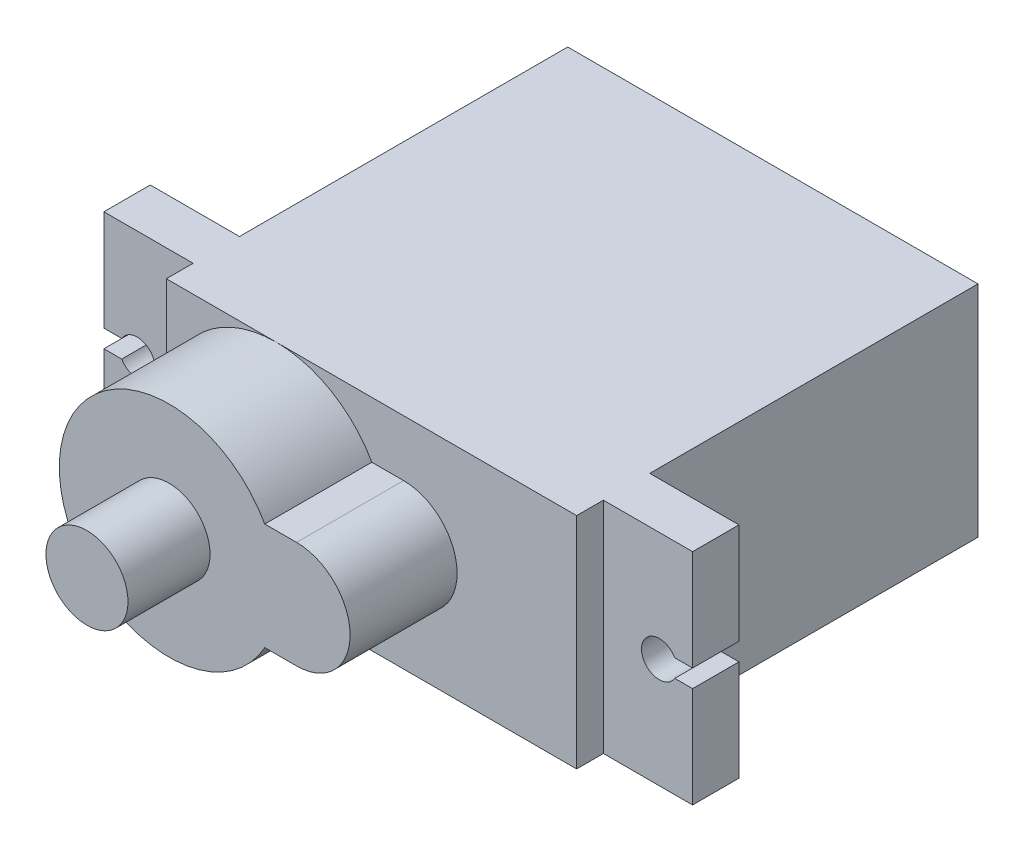
ISO-10303-21;
HEADER;
FILE_DESCRIPTION(('STEP AP214'),'2;1');
FILE_NAME('part.step','',(''),(''),'','','');
FILE_SCHEMA(('AUTOMOTIVE_DESIGN { 1 0 10303 214 1 1 1 1 }'));
ENDSEC;
DATA;
#1=APPLICATION_CONTEXT('core data for automotive mechanical design processes');
#2=APPLICATION_PROTOCOL_DEFINITION('international standard','automotive_design',2000,#1);
#3=PRODUCT_CONTEXT('',#1,'mechanical');
#4=PRODUCT('Part','Part','',(#3));
#5=PRODUCT_RELATED_PRODUCT_CATEGORY('part','',(#4));
#6=PRODUCT_DEFINITION_FORMATION('','',#4);
#7=PRODUCT_DEFINITION_CONTEXT('part definition',#1,'design');
#8=PRODUCT_DEFINITION('design','',#6,#7);
#9=PRODUCT_DEFINITION_SHAPE('','',#8);
#10=(LENGTH_UNIT() NAMED_UNIT(*) SI_UNIT(.MILLI.,.METRE.));
#11=(NAMED_UNIT(*) PLANE_ANGLE_UNIT() SI_UNIT($,.RADIAN.));
#12=(NAMED_UNIT(*) SI_UNIT($,.STERADIAN.) SOLID_ANGLE_UNIT());
#13=UNCERTAINTY_MEASURE_WITH_UNIT(LENGTH_MEASURE(1.E-05),#10,'distance_accuracy_value','');
#14=(GEOMETRIC_REPRESENTATION_CONTEXT(3) GLOBAL_UNCERTAINTY_ASSIGNED_CONTEXT((#13)) GLOBAL_UNIT_ASSIGNED_CONTEXT((#10,
#11,#12)) REPRESENTATION_CONTEXT('',''));
#15=CARTESIAN_POINT('',(0.,0.,0.));
#16=DIRECTION('',(0.,0.,1.));
#17=DIRECTION('',(1.,0.,0.));
#18=AXIS2_PLACEMENT_3D('',#15,#16,#17);
#19=CARTESIAN_POINT('',(16.5,0.,11.25));
#20=DIRECTION('',(1.,0.,0.));
#21=DIRECTION('',(0.,1.,0.));
#22=AXIS2_PLACEMENT_3D('',#19,#20,#21);
#23=PLANE('',#22);
#24=DIRECTION('',(0.,1.,0.));
#25=VECTOR('',#24,1.);
#26=CARTESIAN_POINT('',(16.5,0.,18.4));
#27=LINE('',#26,#25);
#28=CARTESIAN_POINT('',(16.5,-6.15,18.4));
#29=VERTEX_POINT('',#28);
#30=CARTESIAN_POINT('',(16.5,-0.5,18.4));
#31=VERTEX_POINT('',#30);
#32=EDGE_CURVE('E11',#29,#31,#27,.T.);
#33=ORIENTED_EDGE('',*,*,#32,.T.);
#34=DIRECTION('',(0.,0.,1.));
#35=VECTOR('',#34,1.);
#36=CARTESIAN_POINT('',(16.5,-0.5,-0.00199999999999853));
#37=LINE('',#36,#35);
#38=CARTESIAN_POINT('',(16.5,-0.5,21.));
#39=VERTEX_POINT('',#38);
#40=EDGE_CURVE('E26',#31,#39,#37,.T.);
#41=ORIENTED_EDGE('',*,*,#40,.T.);
#42=DIRECTION('',(0.,1.,0.));
#43=VECTOR('',#42,1.);
#44=CARTESIAN_POINT('',(16.5,0.,21.));
#45=LINE('',#44,#43);
#46=CARTESIAN_POINT('',(16.5,-6.15,21.));
#47=VERTEX_POINT('',#46);
#48=EDGE_CURVE('E362',#47,#39,#45,.T.);
#49=ORIENTED_EDGE('',*,*,#48,.F.);
#50=DIRECTION('',(0.,0.,-1.));
#51=VECTOR('',#50,1.);
#52=CARTESIAN_POINT('',(16.5,-6.15,22.5));
#53=LINE('',#52,#51);
#54=EDGE_CURVE('E360',#47,#29,#53,.T.);
#55=ORIENTED_EDGE('',*,*,#54,.T.);
#56=EDGE_LOOP('',(#33,#41,#49,#55));
#57=FACE_BOUND('',#56,.T.);
#58=ADVANCED_FACE('F17',(#57),#23,.T.);
#59=CARTESIAN_POINT('',(-16.5,0.,11.25));
#60=DIRECTION('',(-1.,0.,0.));
#61=DIRECTION('',(0.,-1.,0.));
#62=AXIS2_PLACEMENT_3D('',#59,#60,#61);
#63=PLANE('',#62);
#64=DIRECTION('',(0.,-1.,0.));
#65=VECTOR('',#64,1.);
#66=CARTESIAN_POINT('',(-16.5,0.,18.4));
#67=LINE('',#66,#65);
#68=CARTESIAN_POINT('',(-16.5,6.15,18.4));
#69=VERTEX_POINT('',#68);
#70=CARTESIAN_POINT('',(-16.5,0.5,18.4));
#71=VERTEX_POINT('',#70);
#72=EDGE_CURVE('E357',#69,#71,#67,.T.);
#73=ORIENTED_EDGE('',*,*,#72,.T.);
#74=DIRECTION('',(0.,0.,1.));
#75=VECTOR('',#74,1.);
#76=CARTESIAN_POINT('',(-16.5,0.5,-0.00199999999999853));
#77=LINE('',#76,#75);
#78=CARTESIAN_POINT('',(-16.5,0.5,21.));
#79=VERTEX_POINT('',#78);
#80=EDGE_CURVE('E355',#71,#79,#77,.T.);
#81=ORIENTED_EDGE('',*,*,#80,.T.);
#82=DIRECTION('',(0.,-1.,0.));
#83=VECTOR('',#82,1.);
#84=CARTESIAN_POINT('',(-16.5,0.,21.));
#85=LINE('',#84,#83);
#86=CARTESIAN_POINT('',(-16.5,6.15,21.));
#87=VERTEX_POINT('',#86);
#88=EDGE_CURVE('E353',#87,#79,#85,.T.);
#89=ORIENTED_EDGE('',*,*,#88,.F.);
#90=DIRECTION('',(0.,0.,-1.));
#91=VECTOR('',#90,1.);
#92=CARTESIAN_POINT('',(-16.5,6.15,22.5));
#93=LINE('',#92,#91);
#94=EDGE_CURVE('E351',#87,#69,#93,.T.);
#95=ORIENTED_EDGE('',*,*,#94,.T.);
#96=EDGE_LOOP('',(#73,#81,#89,#95));
#97=FACE_BOUND('',#96,.T.);
#98=ADVANCED_FACE('F407',(#97),#63,.T.);
#99=CARTESIAN_POINT('',(16.5,0.,18.4));
#100=DIRECTION('',(0.,0.,1.));
#101=DIRECTION('',(0.,-1.,0.));
#102=AXIS2_PLACEMENT_3D('',#99,#100,#101);
#103=PLANE('',#102);
#104=DIRECTION('',(1.,0.,0.));
#105=VECTOR('',#104,1.);
#106=CARTESIAN_POINT('',(16.,0.5,18.4));
#107=LINE('',#106,#105);
#108=CARTESIAN_POINT('',(15.5,0.5,18.4));
#109=VERTEX_POINT('',#108);
#110=CARTESIAN_POINT('',(16.5,0.5,18.4));
#111=VERTEX_POINT('',#110);
#112=EDGE_CURVE('E348',#109,#111,#107,.T.);
#113=ORIENTED_EDGE('',*,*,#112,.F.);
#114=CARTESIAN_POINT('',(14.6339745962156,0.,18.4));
#115=DIRECTION('',(0.,0.,1.));
#116=DIRECTION('',(0.,-1.,0.));
#117=AXIS2_PLACEMENT_3D('',#114,#115,#116);
#118=CIRCLE('',#117,1.);
#119=CARTESIAN_POINT('',(15.5,-0.5,18.4));
#120=VERTEX_POINT('',#119);
#121=EDGE_CURVE('E345',#120,#109,#118,.F.);
#122=ORIENTED_EDGE('',*,*,#121,.F.);
#123=DIRECTION('',(1.,0.,0.));
#124=VECTOR('',#123,1.);
#125=CARTESIAN_POINT('',(16.,-0.5,18.4));
#126=LINE('',#125,#124);
#127=EDGE_CURVE('E343',#120,#31,#126,.T.);
#128=ORIENTED_EDGE('',*,*,#127,.T.);
#129=ORIENTED_EDGE('',*,*,#32,.F.);
#130=DIRECTION('',(-1.,0.,0.));
#131=VECTOR('',#130,1.);
#132=CARTESIAN_POINT('',(16.5,-6.15,18.4));
#133=LINE('',#132,#131);
#134=CARTESIAN_POINT('',(11.5,-6.15,18.4));
#135=VERTEX_POINT('',#134);
#136=EDGE_CURVE('E341',#29,#135,#133,.T.);
#137=ORIENTED_EDGE('',*,*,#136,.T.);
#138=DIRECTION('',(0.,1.,0.));
#139=VECTOR('',#138,1.);
#140=CARTESIAN_POINT('',(11.5,0.,18.4));
#141=LINE('',#140,#139);
#142=CARTESIAN_POINT('',(11.5,6.15,18.4));
#143=VERTEX_POINT('',#142);
#144=EDGE_CURVE('E339',#135,#143,#141,.T.);
#145=ORIENTED_EDGE('',*,*,#144,.T.);
#146=DIRECTION('',(-1.,0.,0.));
#147=VECTOR('',#146,1.);
#148=CARTESIAN_POINT('',(16.5,6.15,18.4));
#149=LINE('',#148,#147);
#150=CARTESIAN_POINT('',(16.5,6.15,18.4));
#151=VERTEX_POINT('',#150);
#152=EDGE_CURVE('E336',#151,#143,#149,.T.);
#153=ORIENTED_EDGE('',*,*,#152,.F.);
#154=EDGE_CURVE('E21',#111,#151,#27,.T.);
#155=ORIENTED_EDGE('',*,*,#154,.F.);
#156=EDGE_LOOP('',(#113,#122,#128,#129,#137,#145,#153,#155));
#157=FACE_BOUND('',#156,.T.);
#158=ADVANCED_FACE('F411',(#157),#103,.F.);
#159=CARTESIAN_POINT('',(-16.5,0.,21.));
#160=DIRECTION('',(0.,0.,1.));
#161=DIRECTION('',(1.,0.,0.));
#162=AXIS2_PLACEMENT_3D('',#159,#160,#161);
#163=PLANE('',#162);
#164=ORIENTED_EDGE('',*,*,#88,.T.);
#165=DIRECTION('',(1.,0.,0.));
#166=VECTOR('',#165,1.);
#167=CARTESIAN_POINT('',(-16.,0.5,21.));
#168=LINE('',#167,#166);
#169=CARTESIAN_POINT('',(-15.5,0.5,21.));
#170=VERTEX_POINT('',#169);
#171=EDGE_CURVE('E334',#79,#170,#168,.T.);
#172=ORIENTED_EDGE('',*,*,#171,.T.);
#173=CARTESIAN_POINT('',(-14.6339745962156,0.,21.));
#174=DIRECTION('',(0.,0.,1.));
#175=DIRECTION('',(1.,0.,0.));
#176=AXIS2_PLACEMENT_3D('',#173,#174,#175);
#177=CIRCLE('',#176,1.);
#178=CARTESIAN_POINT('',(-15.5,-0.5,21.));
#179=VERTEX_POINT('',#178);
#180=EDGE_CURVE('E331',#179,#170,#177,.T.);
#181=ORIENTED_EDGE('',*,*,#180,.F.);
#182=DIRECTION('',(1.,0.,0.));
#183=VECTOR('',#182,1.);
#184=CARTESIAN_POINT('',(-16.,-0.5,21.));
#185=LINE('',#184,#183);
#186=CARTESIAN_POINT('',(-16.5,-0.5,21.));
#187=VERTEX_POINT('',#186);
#188=EDGE_CURVE('E328',#187,#179,#185,.T.);
#189=ORIENTED_EDGE('',*,*,#188,.F.);
#190=CARTESIAN_POINT('',(-16.5,-6.15,21.));
#191=VERTEX_POINT('',#190);
#192=EDGE_CURVE('E327',#187,#191,#85,.T.);
#193=ORIENTED_EDGE('',*,*,#192,.T.);
#194=DIRECTION('',(1.,0.,0.));
#195=VECTOR('',#194,1.);
#196=CARTESIAN_POINT('',(-16.5,-6.15,21.));
#197=LINE('',#196,#195);
#198=CARTESIAN_POINT('',(-11.5,-6.15,21.));
#199=VERTEX_POINT('',#198);
#200=EDGE_CURVE('E325',#191,#199,#197,.T.);
#201=ORIENTED_EDGE('',*,*,#200,.T.);
#202=DIRECTION('',(0.,-1.,0.));
#203=VECTOR('',#202,1.);
#204=CARTESIAN_POINT('',(-11.5,0.,21.));
#205=LINE('',#204,#203);
#206=CARTESIAN_POINT('',(-11.5,6.15,21.));
#207=VERTEX_POINT('',#206);
#208=EDGE_CURVE('E322',#207,#199,#205,.T.);
#209=ORIENTED_EDGE('',*,*,#208,.F.);
#210=DIRECTION('',(1.,0.,0.));
#211=VECTOR('',#210,1.);
#212=CARTESIAN_POINT('',(-16.5,6.15,21.));
#213=LINE('',#212,#211);
#214=EDGE_CURVE('E319',#87,#207,#213,.T.);
#215=ORIENTED_EDGE('',*,*,#214,.F.);
#216=EDGE_LOOP('',(#164,#172,#181,#189,#193,#201,#209,#215));
#217=FACE_BOUND('',#216,.T.);
#218=ADVANCED_FACE('F750',(#217),#163,.T.);
#219=CARTESIAN_POINT('',(0.,0.,22.5));
#220=DIRECTION('',(0.,0.,1.));
#221=DIRECTION('',(1.,0.,0.));
#222=AXIS2_PLACEMENT_3D('',#219,#220,#221);
#223=PLANE('',#222);
#224=CARTESIAN_POINT('',(-5.35,0.,22.5));
#225=DIRECTION('',(0.,0.,1.));
#226=DIRECTION('',(1.,0.,0.));
#227=AXIS2_PLACEMENT_3D('',#224,#225,#226);
#228=CIRCLE('',#227,6.15);
#229=CARTESIAN_POINT('',(0.018659050451981,3.,22.5));
#230=VERTEX_POINT('',#229);
#231=CARTESIAN_POINT('',(-5.35,6.15,22.5));
#232=VERTEX_POINT('',#231);
#233=EDGE_CURVE('E316',#230,#232,#228,.T.);
#234=ORIENTED_EDGE('',*,*,#233,.F.);
#235=DIRECTION('',(-1.,0.,0.));
#236=VECTOR('',#235,1.);
#237=CARTESIAN_POINT('',(0.909329525225991,3.,22.5));
#238=LINE('',#237,#236);
#239=CARTESIAN_POINT('',(1.8,3.,22.5));
#240=VERTEX_POINT('',#239);
#241=EDGE_CURVE('E314',#240,#230,#238,.T.);
#242=ORIENTED_EDGE('',*,*,#241,.F.);
#243=CARTESIAN_POINT('',(1.8,0.,22.5));
#244=DIRECTION('',(0.,0.,1.));
#245=DIRECTION('',(1.,0.,0.));
#246=AXIS2_PLACEMENT_3D('',#243,#244,#245);
#247=CIRCLE('',#246,3.);
#248=CARTESIAN_POINT('',(1.8,-3.,22.5));
#249=VERTEX_POINT('',#248);
#250=EDGE_CURVE('E192',#249,#240,#247,.T.);
#251=ORIENTED_EDGE('',*,*,#250,.F.);
#252=DIRECTION('',(-1.,0.,0.));
#253=VECTOR('',#252,1.);
#254=CARTESIAN_POINT('',(0.909329525225992,-3.,22.5));
#255=LINE('',#254,#253);
#256=CARTESIAN_POINT('',(0.0186590504519854,-3.,22.5));
#257=VERTEX_POINT('',#256);
#258=EDGE_CURVE('E310',#249,#257,#255,.T.);
#259=ORIENTED_EDGE('',*,*,#258,.T.);
#260=CARTESIAN_POINT('',(-5.35,-6.15,22.5));
#261=VERTEX_POINT('',#260);
#262=EDGE_CURVE('E312',#261,#257,#228,.T.);
#263=ORIENTED_EDGE('',*,*,#262,.F.);
#264=DIRECTION('',(1.,0.,0.));
#265=VECTOR('',#264,1.);
#266=CARTESIAN_POINT('',(0.,-6.15,22.5));
#267=LINE('',#266,#265);
#268=CARTESIAN_POINT('',(11.5,-6.15,22.5));
#269=VERTEX_POINT('',#268);
#270=EDGE_CURVE('E307',#261,#269,#267,.T.);
#271=ORIENTED_EDGE('',*,*,#270,.T.);
#272=DIRECTION('',(0.,-1.,0.));
#273=VECTOR('',#272,1.);
#274=CARTESIAN_POINT('',(11.5,0.,22.5));
#275=LINE('',#274,#273);
#276=CARTESIAN_POINT('',(11.5,6.15,22.5));
#277=VERTEX_POINT('',#276);
#278=EDGE_CURVE('E304',#277,#269,#275,.T.);
#279=ORIENTED_EDGE('',*,*,#278,.F.);
#280=DIRECTION('',(1.,0.,0.));
#281=VECTOR('',#280,1.);
#282=CARTESIAN_POINT('',(0.,6.15,22.5));
#283=LINE('',#282,#281);
#284=EDGE_CURVE('E303',#232,#277,#283,.T.);
#285=ORIENTED_EDGE('',*,*,#284,.F.);
#286=EDGE_LOOP('',(#234,#242,#251,#259,#263,#271,#279,#285));
#287=FACE_BOUND('',#286,.T.);
#288=ADVANCED_FACE('F662',(#287),#223,.T.);
#289=CARTESIAN_POINT('',(-11.5,0.,22.5));
#290=VERTEX_POINT('',#289);
#291=EDGE_CURVE('E302',#232,#290,#228,.T.);
#292=ORIENTED_EDGE('',*,*,#291,.F.);
#293=CARTESIAN_POINT('',(-11.5,6.15,22.5));
#294=VERTEX_POINT('',#293);
#295=EDGE_CURVE('E299',#294,#232,#283,.T.);
#296=ORIENTED_EDGE('',*,*,#295,.F.);
#297=DIRECTION('',(0.,-1.,0.));
#298=VECTOR('',#297,1.);
#299=CARTESIAN_POINT('',(-11.5,0.,22.5));
#300=LINE('',#299,#298);
#301=EDGE_CURVE('E296',#294,#290,#300,.T.);
#302=ORIENTED_EDGE('',*,*,#301,.T.);
#303=EDGE_LOOP('',(#292,#296,#302));
#304=FACE_BOUND('',#303,.T.);
#305=ADVANCED_FACE('F663',(#304),#223,.T.);
#306=CARTESIAN_POINT('',(-11.5,0.,22.5));
#307=DIRECTION('',(1.,0.,0.));
#308=DIRECTION('',(0.,1.,0.));
#309=AXIS2_PLACEMENT_3D('',#306,#307,#308);
#310=PLANE('',#309);
#311=DIRECTION('',(0.,-1.,0.));
#312=VECTOR('',#311,1.);
#313=CARTESIAN_POINT('',(-11.5,0.,18.4));
#314=LINE('',#313,#312);
#315=CARTESIAN_POINT('',(-11.5,6.15,18.4));
#316=VERTEX_POINT('',#315);
#317=CARTESIAN_POINT('',(-11.5,-6.15,18.4));
#318=VERTEX_POINT('',#317);
#319=EDGE_CURVE('E293',#316,#318,#314,.T.);
#320=ORIENTED_EDGE('',*,*,#319,.F.);
#321=DIRECTION('',(0.,0.,-1.));
#322=VECTOR('',#321,1.);
#323=CARTESIAN_POINT('',(-11.5,6.15,22.5));
#324=LINE('',#323,#322);
#325=CARTESIAN_POINT('',(-11.5,6.15,0.));
#326=VERTEX_POINT('',#325);
#327=EDGE_CURVE('E290',#316,#326,#324,.T.);
#328=ORIENTED_EDGE('',*,*,#327,.T.);
#329=DIRECTION('',(0.,-1.,0.));
#330=VECTOR('',#329,1.);
#331=CARTESIAN_POINT('',(-11.5,0.,0.));
#332=LINE('',#331,#330);
#333=CARTESIAN_POINT('',(-11.5,-6.15,0.));
#334=VERTEX_POINT('',#333);
#335=EDGE_CURVE('E288',#326,#334,#332,.T.);
#336=ORIENTED_EDGE('',*,*,#335,.T.);
#337=DIRECTION('',(0.,0.,-1.));
#338=VECTOR('',#337,1.);
#339=CARTESIAN_POINT('',(-11.5,-6.15,22.5));
#340=LINE('',#339,#338);
#341=EDGE_CURVE('E287',#318,#334,#340,.T.);
#342=ORIENTED_EDGE('',*,*,#341,.F.);
#343=EDGE_LOOP('',(#320,#328,#336,#342));
#344=FACE_BOUND('',#343,.T.);
#345=ADVANCED_FACE('F700',(#344),#310,.F.);
#346=CARTESIAN_POINT('',(11.5,0.,22.5));
#347=DIRECTION('',(1.,0.,0.));
#348=DIRECTION('',(0.,1.,0.));
#349=AXIS2_PLACEMENT_3D('',#346,#347,#348);
#350=PLANE('',#349);
#351=DIRECTION('',(0.,0.,-1.));
#352=VECTOR('',#351,1.);
#353=CARTESIAN_POINT('',(11.5,-6.15,22.5));
#354=LINE('',#353,#352);
#355=CARTESIAN_POINT('',(11.5,-6.15,21.));
#356=VERTEX_POINT('',#355);
#357=EDGE_CURVE('E282',#269,#356,#354,.T.);
#358=ORIENTED_EDGE('',*,*,#357,.T.);
#359=DIRECTION('',(0.,1.,0.));
#360=VECTOR('',#359,1.);
#361=CARTESIAN_POINT('',(11.5,0.,21.));
#362=LINE('',#361,#360);
#363=CARTESIAN_POINT('',(11.5,6.15,21.));
#364=VERTEX_POINT('',#363);
#365=EDGE_CURVE('E280',#356,#364,#362,.T.);
#366=ORIENTED_EDGE('',*,*,#365,.T.);
#367=DIRECTION('',(0.,0.,-1.));
#368=VECTOR('',#367,1.);
#369=CARTESIAN_POINT('',(11.5,6.15,22.5));
#370=LINE('',#369,#368);
#371=EDGE_CURVE('E277',#277,#364,#370,.T.);
#372=ORIENTED_EDGE('',*,*,#371,.F.);
#373=ORIENTED_EDGE('',*,*,#278,.T.);
#374=EDGE_LOOP('',(#358,#366,#372,#373));
#375=FACE_BOUND('',#374,.T.);
#376=ADVANCED_FACE('F676',(#375),#350,.T.);
#377=CARTESIAN_POINT('',(0.,6.15,22.5));
#378=DIRECTION('',(0.,1.,0.));
#379=DIRECTION('',(0.,0.,1.));
#380=AXIS2_PLACEMENT_3D('',#377,#378,#379);
#381=PLANE('',#380);
#382=DIRECTION('',(1.,0.,0.));
#383=VECTOR('',#382,1.);
#384=CARTESIAN_POINT('',(0.,6.15,0.));
#385=LINE('',#384,#383);
#386=CARTESIAN_POINT('',(11.5,6.15,0.));
#387=VERTEX_POINT('',#386);
#388=EDGE_CURVE('E274',#326,#387,#385,.T.);
#389=ORIENTED_EDGE('',*,*,#388,.F.);
#390=ORIENTED_EDGE('',*,*,#327,.F.);
#391=DIRECTION('',(1.,0.,0.));
#392=VECTOR('',#391,1.);
#393=CARTESIAN_POINT('',(-16.5,6.15,18.4));
#394=LINE('',#393,#392);
#395=EDGE_CURVE('E271',#69,#316,#394,.T.);
#396=ORIENTED_EDGE('',*,*,#395,.F.);
#397=ORIENTED_EDGE('',*,*,#94,.F.);
#398=ORIENTED_EDGE('',*,*,#214,.T.);
#399=EDGE_CURVE('E270',#294,#207,#324,.T.);
#400=ORIENTED_EDGE('',*,*,#399,.F.);
#401=ORIENTED_EDGE('',*,*,#295,.T.);
#402=ORIENTED_EDGE('',*,*,#284,.T.);
#403=ORIENTED_EDGE('',*,*,#371,.T.);
#404=DIRECTION('',(-1.,0.,0.));
#405=VECTOR('',#404,1.);
#406=CARTESIAN_POINT('',(16.5,6.15,21.));
#407=LINE('',#406,#405);
#408=CARTESIAN_POINT('',(16.5,6.15,21.));
#409=VERTEX_POINT('',#408);
#410=EDGE_CURVE('E266',#409,#364,#407,.T.);
#411=ORIENTED_EDGE('',*,*,#410,.F.);
#412=DIRECTION('',(0.,0.,-1.));
#413=VECTOR('',#412,1.);
#414=CARTESIAN_POINT('',(16.5,6.15,22.5));
#415=LINE('',#414,#413);
#416=EDGE_CURVE('E263',#409,#151,#415,.T.);
#417=ORIENTED_EDGE('',*,*,#416,.T.);
#418=ORIENTED_EDGE('',*,*,#152,.T.);
#419=EDGE_CURVE('E267',#143,#387,#370,.T.);
#420=ORIENTED_EDGE('',*,*,#419,.T.);
#421=EDGE_LOOP('',(#389,#390,#396,#397,#398,#400,#401,#402,#403,#411,#417,#418,#420));
#422=FACE_BOUND('',#421,.T.);
#423=ADVANCED_FACE('F437',(#422),#381,.T.);
#424=ORIENTED_EDGE('',*,*,#399,.T.);
#425=ORIENTED_EDGE('',*,*,#208,.T.);
#426=CARTESIAN_POINT('',(-11.5,-6.15,22.5));
#427=VERTEX_POINT('',#426);
#428=EDGE_CURVE('E279',#427,#199,#340,.T.);
#429=ORIENTED_EDGE('',*,*,#428,.F.);
#430=EDGE_CURVE('E262',#290,#427,#300,.T.);
#431=ORIENTED_EDGE('',*,*,#430,.F.);
#432=ORIENTED_EDGE('',*,*,#301,.F.);
#433=EDGE_LOOP('',(#424,#425,#429,#431,#432));
#434=FACE_BOUND('',#433,.T.);
#435=ADVANCED_FACE('F686',(#434),#310,.F.);
#436=CARTESIAN_POINT('',(0.,-6.15,22.5));
#437=DIRECTION('',(0.,1.,0.));
#438=DIRECTION('',(0.,0.,1.));
#439=AXIS2_PLACEMENT_3D('',#436,#437,#438);
#440=PLANE('',#439);
#441=DIRECTION('',(1.,0.,0.));
#442=VECTOR('',#441,1.);
#443=CARTESIAN_POINT('',(0.,-6.15,0.));
#444=LINE('',#443,#442);
#445=CARTESIAN_POINT('',(11.5,-6.15,0.));
#446=VERTEX_POINT('',#445);
#447=EDGE_CURVE('E260',#334,#446,#444,.T.);
#448=ORIENTED_EDGE('',*,*,#447,.T.);
#449=EDGE_CURVE('E259',#135,#446,#354,.T.);
#450=ORIENTED_EDGE('',*,*,#449,.F.);
#451=ORIENTED_EDGE('',*,*,#136,.F.);
#452=ORIENTED_EDGE('',*,*,#54,.F.);
#453=DIRECTION('',(-1.,0.,0.));
#454=VECTOR('',#453,1.);
#455=CARTESIAN_POINT('',(16.5,-6.15,21.));
#456=LINE('',#455,#454);
#457=EDGE_CURVE('E256',#47,#356,#456,.T.);
#458=ORIENTED_EDGE('',*,*,#457,.T.);
#459=ORIENTED_EDGE('',*,*,#357,.F.);
#460=ORIENTED_EDGE('',*,*,#270,.F.);
#461=EDGE_CURVE('E255',#427,#261,#267,.T.);
#462=ORIENTED_EDGE('',*,*,#461,.F.);
#463=ORIENTED_EDGE('',*,*,#428,.T.);
#464=ORIENTED_EDGE('',*,*,#200,.F.);
#465=DIRECTION('',(0.,0.,-1.));
#466=VECTOR('',#465,1.);
#467=CARTESIAN_POINT('',(-16.5,-6.15,22.5));
#468=LINE('',#467,#466);
#469=CARTESIAN_POINT('',(-16.5,-6.15,18.4));
#470=VERTEX_POINT('',#469);
#471=EDGE_CURVE('E253',#191,#470,#468,.T.);
#472=ORIENTED_EDGE('',*,*,#471,.T.);
#473=DIRECTION('',(1.,0.,0.));
#474=VECTOR('',#473,1.);
#475=CARTESIAN_POINT('',(-16.5,-6.15,18.4));
#476=LINE('',#475,#474);
#477=EDGE_CURVE('E250',#470,#318,#476,.T.);
#478=ORIENTED_EDGE('',*,*,#477,.T.);
#479=ORIENTED_EDGE('',*,*,#341,.T.);
#480=EDGE_LOOP('',(#448,#450,#451,#452,#458,#459,#460,#462,#463,#464,#472,#478,#479));
#481=FACE_BOUND('',#480,.T.);
#482=ADVANCED_FACE('F673',(#481),#440,.F.);
#483=ORIENTED_EDGE('',*,*,#144,.F.);
#484=ORIENTED_EDGE('',*,*,#449,.T.);
#485=DIRECTION('',(0.,-1.,0.));
#486=VECTOR('',#485,1.);
#487=CARTESIAN_POINT('',(11.5,0.,0.));
#488=LINE('',#487,#486);
#489=EDGE_CURVE('E247',#387,#446,#488,.T.);
#490=ORIENTED_EDGE('',*,*,#489,.F.);
#491=ORIENTED_EDGE('',*,*,#419,.F.);
#492=EDGE_LOOP('',(#483,#484,#490,#491));
#493=FACE_BOUND('',#492,.T.);
#494=ADVANCED_FACE('F659',(#493),#350,.T.);
#495=EDGE_CURVE('E246',#290,#261,#228,.T.);
#496=ORIENTED_EDGE('',*,*,#495,.F.);
#497=ORIENTED_EDGE('',*,*,#430,.T.);
#498=ORIENTED_EDGE('',*,*,#461,.T.);
#499=EDGE_LOOP('',(#496,#497,#498));
#500=FACE_BOUND('',#499,.T.);
#501=ADVANCED_FACE('F647',(#500),#223,.T.);
#502=CARTESIAN_POINT('',(0.,0.,0.));
#503=DIRECTION('',(0.,0.,1.));
#504=DIRECTION('',(1.,0.,0.));
#505=AXIS2_PLACEMENT_3D('',#502,#503,#504);
#506=PLANE('',#505);
#507=ORIENTED_EDGE('',*,*,#388,.T.);
#508=ORIENTED_EDGE('',*,*,#489,.T.);
#509=ORIENTED_EDGE('',*,*,#447,.F.);
#510=ORIENTED_EDGE('',*,*,#335,.F.);
#511=EDGE_LOOP('',(#507,#508,#509,#510));
#512=FACE_BOUND('',#511,.T.);
#513=ADVANCED_FACE('F423',(#512),#506,.F.);
#514=CARTESIAN_POINT('',(16.5,0.,21.));
#515=DIRECTION('',(0.,0.,1.));
#516=DIRECTION('',(1.,0.,0.));
#517=AXIS2_PLACEMENT_3D('',#514,#515,#516);
#518=PLANE('',#517);
#519=DIRECTION('',(-1.,0.,0.));
#520=VECTOR('',#519,1.);
#521=CARTESIAN_POINT('',(16.,0.5,21.));
#522=LINE('',#521,#520);
#523=CARTESIAN_POINT('',(16.5,0.5,21.));
#524=VERTEX_POINT('',#523);
#525=CARTESIAN_POINT('',(15.5,0.5,21.));
#526=VERTEX_POINT('',#525);
#527=EDGE_CURVE('E243',#524,#526,#522,.T.);
#528=ORIENTED_EDGE('',*,*,#527,.F.);
#529=EDGE_CURVE('E242',#524,#409,#45,.T.);
#530=ORIENTED_EDGE('',*,*,#529,.T.);
#531=ORIENTED_EDGE('',*,*,#410,.T.);
#532=ORIENTED_EDGE('',*,*,#365,.F.);
#533=ORIENTED_EDGE('',*,*,#457,.F.);
#534=ORIENTED_EDGE('',*,*,#48,.T.);
#535=DIRECTION('',(-1.,0.,0.));
#536=VECTOR('',#535,1.);
#537=CARTESIAN_POINT('',(16.,-0.5,21.));
#538=LINE('',#537,#536);
#539=CARTESIAN_POINT('',(15.5,-0.5,21.));
#540=VERTEX_POINT('',#539);
#541=EDGE_CURVE('E240',#39,#540,#538,.T.);
#542=ORIENTED_EDGE('',*,*,#541,.T.);
#543=CARTESIAN_POINT('',(14.6339745962156,0.,21.));
#544=DIRECTION('',(0.,0.,1.));
#545=DIRECTION('',(1.,0.,0.));
#546=AXIS2_PLACEMENT_3D('',#543,#544,#545);
#547=CIRCLE('',#546,1.);
#548=EDGE_CURVE('E237',#526,#540,#547,.T.);
#549=ORIENTED_EDGE('',*,*,#548,.F.);
#550=EDGE_LOOP('',(#528,#530,#531,#532,#533,#534,#542,#549));
#551=FACE_BOUND('',#550,.T.);
#552=ADVANCED_FACE('F367',(#551),#518,.T.);
#553=DIRECTION('',(0.,0.,1.));
#554=VECTOR('',#553,1.);
#555=CARTESIAN_POINT('',(16.5,0.5,-0.00199999999999853));
#556=LINE('',#555,#554);
#557=EDGE_CURVE('E234',#111,#524,#556,.T.);
#558=ORIENTED_EDGE('',*,*,#557,.F.);
#559=ORIENTED_EDGE('',*,*,#154,.T.);
#560=ORIENTED_EDGE('',*,*,#416,.F.);
#561=ORIENTED_EDGE('',*,*,#529,.F.);
#562=EDGE_LOOP('',(#558,#559,#560,#561));
#563=FACE_BOUND('',#562,.T.);
#564=ADVANCED_FACE('F19',(#563),#23,.T.);
#565=CARTESIAN_POINT('',(-16.5,0.,18.4));
#566=DIRECTION('',(0.,0.,1.));
#567=DIRECTION('',(1.,0.,0.));
#568=AXIS2_PLACEMENT_3D('',#565,#566,#567);
#569=PLANE('',#568);
#570=CARTESIAN_POINT('',(-14.6339745962156,0.,18.4));
#571=DIRECTION('',(0.,0.,1.));
#572=DIRECTION('',(1.,0.,0.));
#573=AXIS2_PLACEMENT_3D('',#570,#571,#572);
#574=CIRCLE('',#573,1.);
#575=CARTESIAN_POINT('',(-15.5,0.5,18.4));
#576=VERTEX_POINT('',#575);
#577=CARTESIAN_POINT('',(-15.5,-0.5,18.4));
#578=VERTEX_POINT('',#577);
#579=EDGE_CURVE('E231',#576,#578,#574,.F.);
#580=ORIENTED_EDGE('',*,*,#579,.F.);
#581=DIRECTION('',(-1.,0.,0.));
#582=VECTOR('',#581,1.);
#583=CARTESIAN_POINT('',(-16.,0.5,18.4));
#584=LINE('',#583,#582);
#585=EDGE_CURVE('E228',#576,#71,#584,.T.);
#586=ORIENTED_EDGE('',*,*,#585,.T.);
#587=ORIENTED_EDGE('',*,*,#72,.F.);
#588=ORIENTED_EDGE('',*,*,#395,.T.);
#589=ORIENTED_EDGE('',*,*,#319,.T.);
#590=ORIENTED_EDGE('',*,*,#477,.F.);
#591=CARTESIAN_POINT('',(-16.5,-0.5,18.4));
#592=VERTEX_POINT('',#591);
#593=EDGE_CURVE('E227',#592,#470,#67,.T.);
#594=ORIENTED_EDGE('',*,*,#593,.F.);
#595=DIRECTION('',(-1.,0.,0.));
#596=VECTOR('',#595,1.);
#597=CARTESIAN_POINT('',(-16.,-0.5,18.4));
#598=LINE('',#597,#596);
#599=EDGE_CURVE('E224',#578,#592,#598,.T.);
#600=ORIENTED_EDGE('',*,*,#599,.F.);
#601=EDGE_LOOP('',(#580,#586,#587,#588,#589,#590,#594,#600));
#602=FACE_BOUND('',#601,.T.);
#603=ADVANCED_FACE('F415',(#602),#569,.F.);
#604=DIRECTION('',(0.,0.,1.));
#605=VECTOR('',#604,1.);
#606=CARTESIAN_POINT('',(-16.5,-0.5,-0.00199999999999853));
#607=LINE('',#606,#605);
#608=EDGE_CURVE('E221',#592,#187,#607,.T.);
#609=ORIENTED_EDGE('',*,*,#608,.F.);
#610=ORIENTED_EDGE('',*,*,#593,.T.);
#611=ORIENTED_EDGE('',*,*,#471,.F.);
#612=ORIENTED_EDGE('',*,*,#192,.F.);
#613=EDGE_LOOP('',(#609,#610,#611,#612));
#614=FACE_BOUND('',#613,.T.);
#615=ADVANCED_FACE('F413',(#614),#63,.T.);
#616=CARTESIAN_POINT('',(-5.35,0.,28.5));
#617=DIRECTION('',(0.,0.,-1.));
#618=DIRECTION('',(-1.,0.,0.));
#619=AXIS2_PLACEMENT_3D('',#616,#617,#618);
#620=CYLINDRICAL_SURFACE('',#619,6.15);
#621=ORIENTED_EDGE('',*,*,#233,.T.);
#622=ORIENTED_EDGE('',*,*,#291,.T.);
#623=ORIENTED_EDGE('',*,*,#495,.T.);
#624=ORIENTED_EDGE('',*,*,#262,.T.);
#625=DIRECTION('',(0.,0.,-1.));
#626=VECTOR('',#625,1.);
#627=CARTESIAN_POINT('',(0.0186590504519854,-3.,28.5));
#628=LINE('',#627,#626);
#629=CARTESIAN_POINT('',(0.0186590504519854,-3.,28.5));
#630=VERTEX_POINT('',#629);
#631=EDGE_CURVE('E218',#630,#257,#628,.T.);
#632=ORIENTED_EDGE('',*,*,#631,.F.);
#633=CARTESIAN_POINT('',(-5.35,0.,28.5));
#634=DIRECTION('',(0.,0.,1.));
#635=DIRECTION('',(1.,0.,0.));
#636=AXIS2_PLACEMENT_3D('',#633,#634,#635);
#637=CIRCLE('',#636,6.15);
#638=CARTESIAN_POINT('',(0.018659050451981,3.,28.5));
#639=VERTEX_POINT('',#638);
#640=EDGE_CURVE('E216',#639,#630,#637,.T.);
#641=ORIENTED_EDGE('',*,*,#640,.F.);
#642=DIRECTION('',(0.,0.,-1.));
#643=VECTOR('',#642,1.);
#644=CARTESIAN_POINT('',(0.018659050451981,3.,28.5));
#645=LINE('',#644,#643);
#646=EDGE_CURVE('E202',#639,#230,#645,.T.);
#647=ORIENTED_EDGE('',*,*,#646,.T.);
#648=EDGE_LOOP('',(#621,#622,#623,#624,#632,#641,#647));
#649=FACE_BOUND('',#648,.T.);
#650=ADVANCED_FACE('F591',(#649),#620,.T.);
#651=CARTESIAN_POINT('',(0.909329525225992,-3.,28.5));
#652=DIRECTION('',(0.,-1.,0.));
#653=DIRECTION('',(0.,0.,-1.));
#654=AXIS2_PLACEMENT_3D('',#651,#652,#653);
#655=PLANE('',#654);
#656=ORIENTED_EDGE('',*,*,#258,.F.);
#657=DIRECTION('',(0.,0.,-1.));
#658=VECTOR('',#657,1.);
#659=CARTESIAN_POINT('',(1.8,-3.,28.5));
#660=LINE('',#659,#658);
#661=CARTESIAN_POINT('',(1.8,-3.,28.5));
#662=VERTEX_POINT('',#661);
#663=EDGE_CURVE('E213',#662,#249,#660,.T.);
#664=ORIENTED_EDGE('',*,*,#663,.F.);
#665=DIRECTION('',(-1.,0.,0.));
#666=VECTOR('',#665,1.);
#667=CARTESIAN_POINT('',(0.909329525225992,-3.,28.5));
#668=LINE('',#667,#666);
#669=EDGE_CURVE('E195',#662,#630,#668,.T.);
#670=ORIENTED_EDGE('',*,*,#669,.T.);
#671=ORIENTED_EDGE('',*,*,#631,.T.);
#672=EDGE_LOOP('',(#656,#664,#670,#671));
#673=FACE_BOUND('',#672,.T.);
#674=ADVANCED_FACE('F580',(#673),#655,.T.);
#675=CARTESIAN_POINT('',(1.8,0.,28.5));
#676=DIRECTION('',(0.,0.,-1.));
#677=DIRECTION('',(-1.,0.,0.));
#678=AXIS2_PLACEMENT_3D('',#675,#676,#677);
#679=CYLINDRICAL_SURFACE('',#678,3.);
#680=ORIENTED_EDGE('',*,*,#250,.T.);
#681=DIRECTION('',(0.,0.,-1.));
#682=VECTOR('',#681,1.);
#683=CARTESIAN_POINT('',(1.8,3.,28.5));
#684=LINE('',#683,#682);
#685=CARTESIAN_POINT('',(1.8,3.,28.5));
#686=VERTEX_POINT('',#685);
#687=EDGE_CURVE('E185',#686,#240,#684,.T.);
#688=ORIENTED_EDGE('',*,*,#687,.F.);
#689=CARTESIAN_POINT('',(1.8,0.,28.5));
#690=DIRECTION('',(0.,0.,1.));
#691=DIRECTION('',(1.,0.,0.));
#692=AXIS2_PLACEMENT_3D('',#689,#690,#691);
#693=CIRCLE('',#692,3.);
#694=EDGE_CURVE('E190',#662,#686,#693,.T.);
#695=ORIENTED_EDGE('',*,*,#694,.F.);
#696=ORIENTED_EDGE('',*,*,#663,.T.);
#697=EDGE_LOOP('',(#680,#688,#695,#696));
#698=FACE_BOUND('',#697,.T.);
#699=ADVANCED_FACE('F187',(#698),#679,.T.);
#700=CARTESIAN_POINT('',(0.909329525225991,3.,28.5));
#701=DIRECTION('',(0.,-1.,0.));
#702=DIRECTION('',(0.,0.,-1.));
#703=AXIS2_PLACEMENT_3D('',#700,#701,#702);
#704=PLANE('',#703);
#705=ORIENTED_EDGE('',*,*,#241,.T.);
#706=ORIENTED_EDGE('',*,*,#646,.F.);
#707=DIRECTION('',(-1.,0.,0.));
#708=VECTOR('',#707,1.);
#709=CARTESIAN_POINT('',(0.909329525225991,3.,28.5));
#710=LINE('',#709,#708);
#711=EDGE_CURVE('E199',#686,#639,#710,.T.);
#712=ORIENTED_EDGE('',*,*,#711,.F.);
#713=ORIENTED_EDGE('',*,*,#687,.T.);
#714=EDGE_LOOP('',(#705,#706,#712,#713));
#715=FACE_BOUND('',#714,.T.);
#716=ADVANCED_FACE('F200',(#715),#704,.F.);
#717=CARTESIAN_POINT('',(0.,0.,28.5));
#718=DIRECTION('',(0.,0.,1.));
#719=DIRECTION('',(1.,0.,0.));
#720=AXIS2_PLACEMENT_3D('',#717,#718,#719);
#721=PLANE('',#720);
#722=CARTESIAN_POINT('',(-5.35,0.,28.5));
#723=DIRECTION('',(0.,0.,1.));
#724=DIRECTION('',(1.,0.,0.));
#725=AXIS2_PLACEMENT_3D('',#722,#723,#724);
#726=CIRCLE('',#725,2.3);
#727=CARTESIAN_POINT('',(-3.05,0.,28.5));
#728=VERTEX_POINT('',#727);
#729=EDGE_CURVE('E205',#728,#728,#726,.T.);
#730=ORIENTED_EDGE('',*,*,#729,.F.);
#731=EDGE_LOOP('',(#730));
#732=FACE_BOUND('',#731,.T.);
#733=ORIENTED_EDGE('',*,*,#640,.T.);
#734=ORIENTED_EDGE('',*,*,#669,.F.);
#735=ORIENTED_EDGE('',*,*,#694,.T.);
#736=ORIENTED_EDGE('',*,*,#711,.T.);
#737=EDGE_LOOP('',(#733,#734,#735,#736));
#738=FACE_BOUND('',#737,.T.);
#739=ADVANCED_FACE('F207',(#732,#738),#721,.T.);
#740=CARTESIAN_POINT('',(-5.35,0.,33.1));
#741=DIRECTION('',(0.,0.,-1.));
#742=DIRECTION('',(-1.,0.,0.));
#743=AXIS2_PLACEMENT_3D('',#740,#741,#742);
#744=CYLINDRICAL_SURFACE('',#743,2.3);
#745=CARTESIAN_POINT('',(-5.35,0.,33.1));
#746=DIRECTION('',(0.,0.,1.));
#747=DIRECTION('',(1.,0.,0.));
#748=AXIS2_PLACEMENT_3D('',#745,#746,#747);
#749=CIRCLE('',#748,2.3);
#750=CARTESIAN_POINT('',(-3.05,0.,33.1));
#751=VERTEX_POINT('',#750);
#752=EDGE_CURVE('E388',#751,#751,#749,.T.);
#753=ORIENTED_EDGE('',*,*,#752,.F.);
#754=EDGE_LOOP('',(#753));
#755=FACE_BOUND('',#754,.T.);
#756=ORIENTED_EDGE('',*,*,#729,.T.);
#757=EDGE_LOOP('',(#756));
#758=FACE_BOUND('',#757,.T.);
#759=ADVANCED_FACE('F393',(#755,#758),#744,.T.);
#760=CARTESIAN_POINT('',(-3.35,0.,33.1));
#761=DIRECTION('',(0.,0.,1.));
#762=DIRECTION('',(1.,0.,0.));
#763=AXIS2_PLACEMENT_3D('',#760,#761,#762);
#764=PLANE('',#763);
#765=ORIENTED_EDGE('',*,*,#752,.T.);
#766=EDGE_LOOP('',(#765));
#767=FACE_BOUND('',#766,.T.);
#768=ADVANCED_FACE('F402',(#767),#764,.T.);
#769=CARTESIAN_POINT('',(-16.,-0.5,-0.00199999999999853));
#770=DIRECTION('',(0.,-1.,0.));
#771=DIRECTION('',(0.,0.,-1.));
#772=AXIS2_PLACEMENT_3D('',#769,#770,#771);
#773=PLANE('',#772);
#774=ORIENTED_EDGE('',*,*,#599,.T.);
#775=ORIENTED_EDGE('',*,*,#608,.T.);
#776=ORIENTED_EDGE('',*,*,#188,.T.);
#777=DIRECTION('',(0.,0.,1.));
#778=VECTOR('',#777,1.);
#779=CARTESIAN_POINT('',(-15.5,-0.5,-0.00199999999999853));
#780=LINE('',#779,#778);
#781=EDGE_CURVE('E385',#578,#179,#780,.T.);
#782=ORIENTED_EDGE('',*,*,#781,.F.);
#783=EDGE_LOOP('',(#774,#775,#776,#782));
#784=FACE_BOUND('',#783,.T.);
#785=ADVANCED_FACE('F458',(#784),#773,.F.);
#786=CARTESIAN_POINT('',(-16.,0.5,-0.00199999999999853));
#787=DIRECTION('',(0.,-1.,0.));
#788=DIRECTION('',(1.,0.,0.));
#789=AXIS2_PLACEMENT_3D('',#786,#787,#788);
#790=PLANE('',#789);
#791=DIRECTION('',(0.,0.,1.));
#792=VECTOR('',#791,1.);
#793=CARTESIAN_POINT('',(-15.5,0.5,-0.00199999999999853));
#794=LINE('',#793,#792);
#795=EDGE_CURVE('E380',#576,#170,#794,.T.);
#796=ORIENTED_EDGE('',*,*,#795,.T.);
#797=ORIENTED_EDGE('',*,*,#171,.F.);
#798=ORIENTED_EDGE('',*,*,#80,.F.);
#799=ORIENTED_EDGE('',*,*,#585,.F.);
#800=EDGE_LOOP('',(#796,#797,#798,#799));
#801=FACE_BOUND('',#800,.T.);
#802=ADVANCED_FACE('F454',(#801),#790,.T.);
#803=CARTESIAN_POINT('',(-14.6339745962156,0.,-0.00199999999999853));
#804=DIRECTION('',(0.,0.,1.));
#805=DIRECTION('',(1.,0.,0.));
#806=AXIS2_PLACEMENT_3D('',#803,#804,#805);
#807=CYLINDRICAL_SURFACE('',#806,1.);
#808=ORIENTED_EDGE('',*,*,#579,.T.);
#809=ORIENTED_EDGE('',*,*,#781,.T.);
#810=ORIENTED_EDGE('',*,*,#180,.T.);
#811=ORIENTED_EDGE('',*,*,#795,.F.);
#812=EDGE_LOOP('',(#808,#809,#810,#811));
#813=FACE_BOUND('',#812,.T.);
#814=ADVANCED_FACE('F449',(#813),#807,.F.);
#815=CARTESIAN_POINT('',(16.,0.5,-0.00199999999999853));
#816=DIRECTION('',(0.,1.,0.));
#817=DIRECTION('',(0.,0.,1.));
#818=AXIS2_PLACEMENT_3D('',#815,#816,#817);
#819=PLANE('',#818);
#820=ORIENTED_EDGE('',*,*,#112,.T.);
#821=ORIENTED_EDGE('',*,*,#557,.T.);
#822=ORIENTED_EDGE('',*,*,#527,.T.);
#823=DIRECTION('',(0.,0.,1.));
#824=VECTOR('',#823,1.);
#825=CARTESIAN_POINT('',(15.5,0.5,-0.00199999999999853));
#826=LINE('',#825,#824);
#827=EDGE_CURVE('E377',#109,#526,#826,.T.);
#828=ORIENTED_EDGE('',*,*,#827,.F.);
#829=EDGE_LOOP('',(#820,#821,#822,#828));
#830=FACE_BOUND('',#829,.T.);
#831=ADVANCED_FACE('F431',(#830),#819,.F.);
#832=CARTESIAN_POINT('',(14.6339745962156,0.,-0.00199999999999853));
#833=DIRECTION('',(0.,0.,1.));
#834=DIRECTION('',(1.,0.,0.));
#835=AXIS2_PLACEMENT_3D('',#832,#833,#834);
#836=CYLINDRICAL_SURFACE('',#835,1.);
#837=ORIENTED_EDGE('',*,*,#121,.T.);
#838=ORIENTED_EDGE('',*,*,#827,.T.);
#839=ORIENTED_EDGE('',*,*,#548,.T.);
#840=DIRECTION('',(0.,0.,1.));
#841=VECTOR('',#840,1.);
#842=CARTESIAN_POINT('',(15.5,-0.5,-0.00199999999999853));
#843=LINE('',#842,#841);
#844=EDGE_CURVE('E375',#120,#540,#843,.T.);
#845=ORIENTED_EDGE('',*,*,#844,.F.);
#846=EDGE_LOOP('',(#837,#838,#839,#845));
#847=FACE_BOUND('',#846,.T.);
#848=ADVANCED_FACE('F441',(#847),#836,.F.);
#849=CARTESIAN_POINT('',(16.,-0.5,-0.00199999999999853));
#850=DIRECTION('',(0.,1.,0.));
#851=DIRECTION('',(0.,0.,1.));
#852=AXIS2_PLACEMENT_3D('',#849,#850,#851);
#853=PLANE('',#852);
#854=ORIENTED_EDGE('',*,*,#844,.T.);
#855=ORIENTED_EDGE('',*,*,#541,.F.);
#856=ORIENTED_EDGE('',*,*,#40,.F.);
#857=ORIENTED_EDGE('',*,*,#127,.F.);
#858=EDGE_LOOP('',(#854,#855,#856,#857));
#859=FACE_BOUND('',#858,.T.);
#860=ADVANCED_FACE('F372',(#859),#853,.T.);
#861=CLOSED_SHELL('',(#58,#98,#158,#218,#288,#305,#345,#376,#423,#435,#482,#494,#501,#513,#552,
#564,#603,#615,#650,#674,#699,#716,#739,#759,#768,#785,#802,#814,#831,#848,#860));
#862=MANIFOLD_SOLID_BREP('B1',#861);
#863=ADVANCED_BREP_SHAPE_REPRESENTATION('',(#18,#862),#14);
#864=SHAPE_DEFINITION_REPRESENTATION(#9,#863);
ENDSEC;
END-ISO-10303-21;
